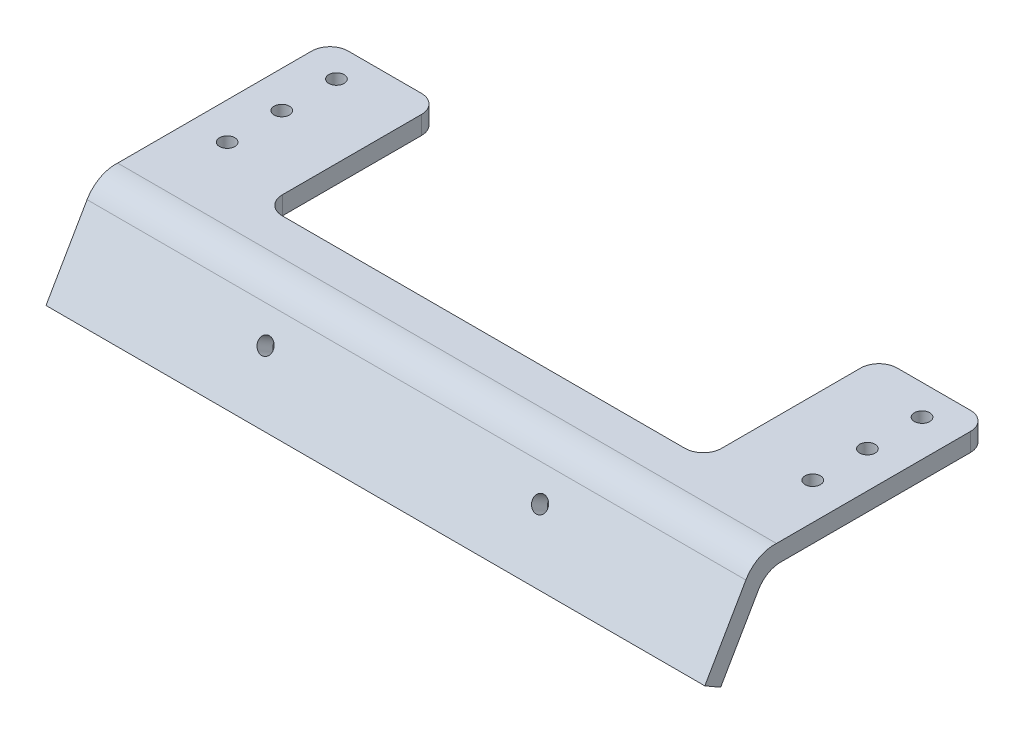
ISO-10303-21;
HEADER;
FILE_DESCRIPTION(('STEP AP214'),'2;1');
FILE_NAME('part.step','',(''),(''),'','','');
FILE_SCHEMA(('AUTOMOTIVE_DESIGN { 1 0 10303 214 1 1 1 1 }'));
ENDSEC;
DATA;
#1=APPLICATION_CONTEXT('core data for automotive mechanical design processes');
#2=APPLICATION_PROTOCOL_DEFINITION('international standard','automotive_design',2000,#1);
#3=PRODUCT_CONTEXT('',#1,'mechanical');
#4=PRODUCT('Part','Part','',(#3));
#5=PRODUCT_RELATED_PRODUCT_CATEGORY('part','',(#4));
#6=PRODUCT_DEFINITION_FORMATION('','',#4);
#7=PRODUCT_DEFINITION_CONTEXT('part definition',#1,'design');
#8=PRODUCT_DEFINITION('design','',#6,#7);
#9=PRODUCT_DEFINITION_SHAPE('','',#8);
#10=(LENGTH_UNIT() NAMED_UNIT(*) SI_UNIT(.MILLI.,.METRE.));
#11=(NAMED_UNIT(*) PLANE_ANGLE_UNIT() SI_UNIT($,.RADIAN.));
#12=(NAMED_UNIT(*) SI_UNIT($,.STERADIAN.) SOLID_ANGLE_UNIT());
#13=UNCERTAINTY_MEASURE_WITH_UNIT(LENGTH_MEASURE(1.E-05),#10,'distance_accuracy_value','');
#14=(GEOMETRIC_REPRESENTATION_CONTEXT(3) GLOBAL_UNCERTAINTY_ASSIGNED_CONTEXT((#13)) GLOBAL_UNIT_ASSIGNED_CONTEXT((#10,
#11,#12)) REPRESENTATION_CONTEXT('',''));
#15=CARTESIAN_POINT('',(0.,0.,0.));
#16=DIRECTION('',(0.,0.,1.));
#17=DIRECTION('',(1.,0.,0.));
#18=AXIS2_PLACEMENT_3D('',#15,#16,#17);
#19=CARTESIAN_POINT('',(-90.,5.,-31.5));
#20=DIRECTION('',(0.,0.,1.));
#21=DIRECTION('',(1.,0.,0.));
#22=AXIS2_PLACEMENT_3D('',#19,#20,#21);
#23=PLANE('',#22);
#24=DIRECTION('',(-1.,0.,0.));
#25=VECTOR('',#24,1.);
#26=CARTESIAN_POINT('',(-90.,0.,-31.5));
#27=LINE('',#26,#25);
#28=CARTESIAN_POINT('',(84.9999999999999,0.,-31.5));
#29=VERTEX_POINT('',#28);
#30=CARTESIAN_POINT('',(65.,0.,-31.5));
#31=VERTEX_POINT('',#30);
#32=EDGE_CURVE('E251',#29,#31,#27,.T.);
#33=ORIENTED_EDGE('',*,*,#32,.T.);
#34=DIRECTION('',(0.,1.,0.));
#35=VECTOR('',#34,1.);
#36=CARTESIAN_POINT('',(65.,5.,-31.5));
#37=LINE('',#36,#35);
#38=CARTESIAN_POINT('',(65.,5.,-31.5));
#39=VERTEX_POINT('',#38);
#40=EDGE_CURVE('E287',#31,#39,#37,.T.);
#41=ORIENTED_EDGE('',*,*,#40,.T.);
#42=DIRECTION('',(-1.,0.,0.));
#43=VECTOR('',#42,1.);
#44=CARTESIAN_POINT('',(-90.,5.,-31.5));
#45=LINE('',#44,#43);
#46=CARTESIAN_POINT('',(84.9999999999999,5.,-31.5));
#47=VERTEX_POINT('',#46);
#48=EDGE_CURVE('E244',#47,#39,#45,.T.);
#49=ORIENTED_EDGE('',*,*,#48,.F.);
#50=DIRECTION('',(0.,-1.,0.));
#51=VECTOR('',#50,1.);
#52=CARTESIAN_POINT('',(85.,5.,-31.5));
#53=LINE('',#52,#51);
#54=EDGE_CURVE('E284',#47,#29,#53,.T.);
#55=ORIENTED_EDGE('',*,*,#54,.T.);
#56=EDGE_LOOP('',(#33,#41,#49,#55));
#57=FACE_BOUND('',#56,.T.);
#58=ADVANCED_FACE('F34',(#57),#23,.F.);
#59=CARTESIAN_POINT('',(90.,5.,-31.5));
#60=DIRECTION('',(-1.,0.,0.));
#61=DIRECTION('',(0.,0.,1.));
#62=AXIS2_PLACEMENT_3D('',#59,#60,#61);
#63=PLANE('',#62);
#64=DIRECTION('',(0.,0.,-1.));
#65=VECTOR('',#64,1.);
#66=CARTESIAN_POINT('',(90.,0.,-31.5));
#67=LINE('',#66,#65);
#68=CARTESIAN_POINT('',(90.,0.,25.3452994616207));
#69=VERTEX_POINT('',#68);
#70=CARTESIAN_POINT('',(90.,0.,-26.5));
#71=VERTEX_POINT('',#70);
#72=EDGE_CURVE('E234',#69,#71,#67,.T.);
#73=ORIENTED_EDGE('',*,*,#72,.T.);
#74=DIRECTION('',(0.,-1.,0.));
#75=VECTOR('',#74,1.);
#76=CARTESIAN_POINT('',(90.,5.,-26.5));
#77=LINE('',#76,#75);
#78=CARTESIAN_POINT('',(90.,5.,-26.5));
#79=VERTEX_POINT('',#78);
#80=EDGE_CURVE('E304',#71,#79,#77,.F.);
#81=ORIENTED_EDGE('',*,*,#80,.T.);
#82=DIRECTION('',(0.,0.,-1.));
#83=VECTOR('',#82,1.);
#84=CARTESIAN_POINT('',(90.,5.,-31.5));
#85=LINE('',#84,#83);
#86=CARTESIAN_POINT('',(90.,5.,26.5));
#87=VERTEX_POINT('',#86);
#88=EDGE_CURVE('E237',#87,#79,#85,.T.);
#89=ORIENTED_EDGE('',*,*,#88,.F.);
#90=CARTESIAN_POINT('',(90.,-3.98212002188447,27.0670272590115));
#91=DIRECTION('',(-1.,0.,0.));
#92=DIRECTION('',(0.,0.,1.));
#93=AXIS2_PLACEMENT_3D('',#90,#91,#92);
#94=CIRCLE('',#93,9.);
#95=CARTESIAN_POINT('',(90.,0.517879978115491,34.8612558930714));
#96=VERTEX_POINT('',#95);
#97=EDGE_CURVE('E256',#87,#96,#94,.F.);
#98=ORIENTED_EDGE('',*,*,#97,.T.);
#99=DIRECTION('',(0.,0.86602540378444,-0.499999999999998));
#100=VECTOR('',#99,1.);
#101=CARTESIAN_POINT('',(90.,-18.9137748154254,46.0801270189221));
#102=LINE('',#101,#100);
#103=CARTESIAN_POINT('',(90.,-18.9137748154254,46.0801270189221));
#104=VERTEX_POINT('',#103);
#105=EDGE_CURVE('E171',#104,#96,#102,.T.);
#106=ORIENTED_EDGE('',*,*,#105,.F.);
#107=DIRECTION('',(0.,-0.499999999999998,-0.86602540378444));
#108=VECTOR('',#107,1.);
#109=CARTESIAN_POINT('',(90.,-18.9137748154254,46.0801270189221));
#110=LINE('',#109,#108);
#111=CARTESIAN_POINT('',(90.,-21.4137748154254,41.7499999999999));
#112=VERTEX_POINT('',#111);
#113=EDGE_CURVE('E182',#104,#112,#110,.T.);
#114=ORIENTED_EDGE('',*,*,#113,.T.);
#115=DIRECTION('',(0.,0.86602540378444,-0.499999999999998));
#116=VECTOR('',#115,1.);
#117=CARTESIAN_POINT('',(90.,-21.4137748154254,41.7499999999999));
#118=LINE('',#117,#116);
#119=CARTESIAN_POINT('',(90.,-3.50000000000002,31.4074772881118));
#120=VERTEX_POINT('',#119);
#121=EDGE_CURVE('E191',#112,#120,#118,.T.);
#122=ORIENTED_EDGE('',*,*,#121,.T.);
#123=CARTESIAN_POINT('',(90.,-7.,25.3452994616207));
#124=DIRECTION('',(-1.,0.,0.));
#125=DIRECTION('',(0.,0.,1.));
#126=AXIS2_PLACEMENT_3D('',#123,#124,#125);
#127=CIRCLE('',#126,7.);
#128=EDGE_CURVE('E265',#120,#69,#127,.T.);
#129=ORIENTED_EDGE('',*,*,#128,.T.);
#130=EDGE_LOOP('',(#73,#81,#89,#98,#106,#114,#122,#129));
#131=FACE_BOUND('',#130,.T.);
#132=ADVANCED_FACE('F395',(#131),#63,.F.);
#133=CARTESIAN_POINT('',(-65.,0.,-31.5));
#134=VERTEX_POINT('',#133);
#135=CARTESIAN_POINT('',(-85.,0.,-31.5));
#136=VERTEX_POINT('',#135);
#137=EDGE_CURVE('E249',#134,#136,#27,.T.);
#138=ORIENTED_EDGE('',*,*,#137,.T.);
#139=DIRECTION('',(0.,-1.,0.));
#140=VECTOR('',#139,1.);
#141=CARTESIAN_POINT('',(-85.,5.,-31.5));
#142=LINE('',#141,#140);
#143=CARTESIAN_POINT('',(-85.,5.,-31.5));
#144=VERTEX_POINT('',#143);
#145=EDGE_CURVE('E311',#136,#144,#142,.F.);
#146=ORIENTED_EDGE('',*,*,#145,.T.);
#147=CARTESIAN_POINT('',(-65.,5.,-31.5));
#148=VERTEX_POINT('',#147);
#149=EDGE_CURVE('E240',#148,#144,#45,.T.);
#150=ORIENTED_EDGE('',*,*,#149,.F.);
#151=DIRECTION('',(0.,-1.,0.));
#152=VECTOR('',#151,1.);
#153=CARTESIAN_POINT('',(-65.,5.,-31.5));
#154=LINE('',#153,#152);
#155=EDGE_CURVE('E309',#148,#134,#154,.T.);
#156=ORIENTED_EDGE('',*,*,#155,.T.);
#157=EDGE_LOOP('',(#138,#146,#150,#156));
#158=FACE_BOUND('',#157,.T.);
#159=ADVANCED_FACE('F374',(#158),#23,.F.);
#160=CARTESIAN_POINT('',(-90.,5.,-31.5));
#161=DIRECTION('',(1.,0.,0.));
#162=DIRECTION('',(0.,0.,-1.));
#163=AXIS2_PLACEMENT_3D('',#160,#161,#162);
#164=PLANE('',#163);
#165=DIRECTION('',(0.,0.,1.));
#166=VECTOR('',#165,1.);
#167=CARTESIAN_POINT('',(-90.,5.,-31.5));
#168=LINE('',#167,#166);
#169=CARTESIAN_POINT('',(-90.,5.,-26.5));
#170=VERTEX_POINT('',#169);
#171=CARTESIAN_POINT('',(-90.,5.,26.5));
#172=VERTEX_POINT('',#171);
#173=EDGE_CURVE('E245',#170,#172,#168,.T.);
#174=ORIENTED_EDGE('',*,*,#173,.F.);
#175=DIRECTION('',(0.,-1.,0.));
#176=VECTOR('',#175,1.);
#177=CARTESIAN_POINT('',(-90.,5.,-26.5));
#178=LINE('',#177,#176);
#179=CARTESIAN_POINT('',(-90.,0.,-26.5));
#180=VERTEX_POINT('',#179);
#181=EDGE_CURVE('E306',#170,#180,#178,.T.);
#182=ORIENTED_EDGE('',*,*,#181,.T.);
#183=DIRECTION('',(0.,0.,1.));
#184=VECTOR('',#183,1.);
#185=CARTESIAN_POINT('',(-90.,0.,-31.5));
#186=LINE('',#185,#184);
#187=CARTESIAN_POINT('',(-90.,0.,25.3452994616207));
#188=VERTEX_POINT('',#187);
#189=EDGE_CURVE('E241',#180,#188,#186,.T.);
#190=ORIENTED_EDGE('',*,*,#189,.T.);
#191=CARTESIAN_POINT('',(-90.,-7.,25.3452994616207));
#192=DIRECTION('',(1.,0.,0.));
#193=DIRECTION('',(0.,0.,-1.));
#194=AXIS2_PLACEMENT_3D('',#191,#192,#193);
#195=CIRCLE('',#194,7.);
#196=CARTESIAN_POINT('',(-90.,-3.50000000000002,31.4074772881118));
#197=VERTEX_POINT('',#196);
#198=EDGE_CURVE('E263',#188,#197,#195,.T.);
#199=ORIENTED_EDGE('',*,*,#198,.T.);
#200=DIRECTION('',(0.,-0.86602540378444,0.499999999999998));
#201=VECTOR('',#200,1.);
#202=CARTESIAN_POINT('',(-90.,-21.4137748154254,41.7499999999999));
#203=LINE('',#202,#201);
#204=CARTESIAN_POINT('',(-90.,-21.4137748154254,41.7499999999999));
#205=VERTEX_POINT('',#204);
#206=EDGE_CURVE('E178',#197,#205,#203,.T.);
#207=ORIENTED_EDGE('',*,*,#206,.T.);
#208=DIRECTION('',(0.,-0.499999999999998,-0.86602540378444));
#209=VECTOR('',#208,1.);
#210=CARTESIAN_POINT('',(-90.,-18.9137748154254,46.0801270189221));
#211=LINE('',#210,#209);
#212=CARTESIAN_POINT('',(-90.,-18.9137748154254,46.0801270189221));
#213=VERTEX_POINT('',#212);
#214=EDGE_CURVE('E174',#213,#205,#211,.T.);
#215=ORIENTED_EDGE('',*,*,#214,.F.);
#216=DIRECTION('',(0.,-0.86602540378444,0.499999999999998));
#217=VECTOR('',#216,1.);
#218=CARTESIAN_POINT('',(-90.,-18.9137748154254,46.0801270189221));
#219=LINE('',#218,#217);
#220=CARTESIAN_POINT('',(-90.,0.517879978115507,34.8612558930715));
#221=VERTEX_POINT('',#220);
#222=EDGE_CURVE('E160',#221,#213,#219,.T.);
#223=ORIENTED_EDGE('',*,*,#222,.F.);
#224=CARTESIAN_POINT('',(-90.,-3.98212002188447,27.0670272590115));
#225=DIRECTION('',(1.,0.,0.));
#226=DIRECTION('',(0.,0.,-1.));
#227=AXIS2_PLACEMENT_3D('',#224,#225,#226);
#228=CIRCLE('',#227,9.);
#229=EDGE_CURVE('E254',#221,#172,#228,.F.);
#230=ORIENTED_EDGE('',*,*,#229,.T.);
#231=EDGE_LOOP('',(#174,#182,#190,#199,#207,#215,#223,#230));
#232=FACE_BOUND('',#231,.T.);
#233=ADVANCED_FACE('F176',(#232),#164,.F.);
#234=CARTESIAN_POINT('',(0.,5.,0.));
#235=DIRECTION('',(0.,1.,0.));
#236=DIRECTION('',(0.,0.,1.));
#237=AXIS2_PLACEMENT_3D('',#234,#235,#236);
#238=PLANE('',#237);
#239=ORIENTED_EDGE('',*,*,#48,.T.);
#240=CARTESIAN_POINT('',(65.,5.,-26.5));
#241=DIRECTION('',(0.,1.,0.));
#242=DIRECTION('',(0.,0.,1.));
#243=AXIS2_PLACEMENT_3D('',#240,#241,#242);
#244=CIRCLE('',#243,5.);
#245=CARTESIAN_POINT('',(60.,5.,-26.5));
#246=VERTEX_POINT('',#245);
#247=EDGE_CURVE('E296',#39,#246,#244,.T.);
#248=ORIENTED_EDGE('',*,*,#247,.T.);
#249=DIRECTION('',(0.,0.,-1.));
#250=VECTOR('',#249,1.);
#251=CARTESIAN_POINT('',(60.,5.,-33.5));
#252=LINE('',#251,#250);
#253=CARTESIAN_POINT('',(60.,5.,11.5));
#254=VERTEX_POINT('',#253);
#255=EDGE_CURVE('E325',#254,#246,#252,.T.);
#256=ORIENTED_EDGE('',*,*,#255,.F.);
#257=CARTESIAN_POINT('',(55.,5.,11.5));
#258=DIRECTION('',(0.,1.,0.));
#259=DIRECTION('',(0.,0.,1.));
#260=AXIS2_PLACEMENT_3D('',#257,#258,#259);
#261=CIRCLE('',#260,5.);
#262=CARTESIAN_POINT('',(55.,5.,16.5));
#263=VERTEX_POINT('',#262);
#264=EDGE_CURVE('E42',#254,#263,#261,.F.);
#265=ORIENTED_EDGE('',*,*,#264,.T.);
#266=DIRECTION('',(1.,0.,0.));
#267=VECTOR('',#266,1.);
#268=CARTESIAN_POINT('',(-60.,5.,16.5));
#269=LINE('',#268,#267);
#270=CARTESIAN_POINT('',(-55.,5.,16.5));
#271=VERTEX_POINT('',#270);
#272=EDGE_CURVE('E323',#271,#263,#269,.T.);
#273=ORIENTED_EDGE('',*,*,#272,.F.);
#274=CARTESIAN_POINT('',(-55.,5.,11.5));
#275=DIRECTION('',(0.,1.,0.));
#276=DIRECTION('',(0.,0.,1.));
#277=AXIS2_PLACEMENT_3D('',#274,#275,#276);
#278=CIRCLE('',#277,5.);
#279=CARTESIAN_POINT('',(-60.,5.,11.5));
#280=VERTEX_POINT('',#279);
#281=EDGE_CURVE('E313',#271,#280,#278,.F.);
#282=ORIENTED_EDGE('',*,*,#281,.T.);
#283=DIRECTION('',(0.,0.,1.));
#284=VECTOR('',#283,1.);
#285=CARTESIAN_POINT('',(-60.,5.,-33.5));
#286=LINE('',#285,#284);
#287=CARTESIAN_POINT('',(-60.,5.,-26.5));
#288=VERTEX_POINT('',#287);
#289=EDGE_CURVE('E335',#288,#280,#286,.T.);
#290=ORIENTED_EDGE('',*,*,#289,.F.);
#291=CARTESIAN_POINT('',(-65.,5.,-26.5));
#292=DIRECTION('',(0.,1.,0.));
#293=DIRECTION('',(0.,0.,1.));
#294=AXIS2_PLACEMENT_3D('',#291,#292,#293);
#295=CIRCLE('',#294,5.);
#296=EDGE_CURVE('E290',#288,#148,#295,.T.);
#297=ORIENTED_EDGE('',*,*,#296,.T.);
#298=ORIENTED_EDGE('',*,*,#149,.T.);
#299=CARTESIAN_POINT('',(-85.,5.,-26.5));
#300=DIRECTION('',(0.,1.,0.));
#301=DIRECTION('',(0.,0.,1.));
#302=AXIS2_PLACEMENT_3D('',#299,#300,#301);
#303=CIRCLE('',#302,5.);
#304=EDGE_CURVE('E292',#144,#170,#303,.T.);
#305=ORIENTED_EDGE('',*,*,#304,.T.);
#306=ORIENTED_EDGE('',*,*,#173,.T.);
#307=DIRECTION('',(-1.,0.,0.));
#308=VECTOR('',#307,1.);
#309=CARTESIAN_POINT('',(110.,5.,26.5));
#310=LINE('',#309,#308);
#311=EDGE_CURVE('E181',#87,#172,#310,.T.);
#312=ORIENTED_EDGE('',*,*,#311,.F.);
#313=ORIENTED_EDGE('',*,*,#88,.T.);
#314=CARTESIAN_POINT('',(85.,5.,-26.5));
#315=DIRECTION('',(0.,1.,0.));
#316=DIRECTION('',(0.,0.,1.));
#317=AXIS2_PLACEMENT_3D('',#314,#315,#316);
#318=CIRCLE('',#317,5.);
#319=EDGE_CURVE('E294',#79,#47,#318,.T.);
#320=ORIENTED_EDGE('',*,*,#319,.T.);
#321=EDGE_LOOP('',(#239,#248,#256,#265,#273,#282,#290,#297,#298,#305,#306,#312,#313,#320));
#322=FACE_BOUND('',#321,.T.);
#323=CARTESIAN_POINT('',(80.0000000000002,5.,-8.34));
#324=DIRECTION('',(0.,1.,0.));
#325=DIRECTION('',(0.,0.,1.));
#326=AXIS2_PLACEMENT_3D('',#323,#324,#325);
#327=CIRCLE('',#326,2.1);
#328=CARTESIAN_POINT('',(80.0000000000002,5.,-6.24));
#329=VERTEX_POINT('',#328);
#330=EDGE_CURVE('E211',#329,#329,#327,.T.);
#331=ORIENTED_EDGE('',*,*,#330,.F.);
#332=EDGE_LOOP('',(#331));
#333=FACE_BOUND('',#332,.T.);
#334=CARTESIAN_POINT('',(80.0000000000002,5.,6.59));
#335=DIRECTION('',(0.,1.,0.));
#336=DIRECTION('',(0.,0.,1.));
#337=AXIS2_PLACEMENT_3D('',#334,#335,#336);
#338=CIRCLE('',#337,2.1);
#339=CARTESIAN_POINT('',(80.0000000000002,5.,8.69));
#340=VERTEX_POINT('',#339);
#341=EDGE_CURVE('E217',#340,#340,#338,.T.);
#342=ORIENTED_EDGE('',*,*,#341,.F.);
#343=EDGE_LOOP('',(#342));
#344=FACE_BOUND('',#343,.T.);
#345=CARTESIAN_POINT('',(-79.9999999999992,5.,-23.27));
#346=DIRECTION('',(0.,1.,0.));
#347=DIRECTION('',(0.,0.,-1.));
#348=AXIS2_PLACEMENT_3D('',#345,#346,#347);
#349=CIRCLE('',#348,2.1);
#350=CARTESIAN_POINT('',(-79.9999999999992,5.,-25.37));
#351=VERTEX_POINT('',#350);
#352=EDGE_CURVE('E223',#351,#351,#349,.T.);
#353=ORIENTED_EDGE('',*,*,#352,.F.);
#354=EDGE_LOOP('',(#353));
#355=FACE_BOUND('',#354,.T.);
#356=CARTESIAN_POINT('',(-79.9999999999992,5.,-8.34));
#357=DIRECTION('',(0.,1.,0.));
#358=DIRECTION('',(0.,0.,-1.));
#359=AXIS2_PLACEMENT_3D('',#356,#357,#358);
#360=CIRCLE('',#359,2.1);
#361=CARTESIAN_POINT('',(-79.9999999999992,5.,-10.44));
#362=VERTEX_POINT('',#361);
#363=EDGE_CURVE('E204',#362,#362,#360,.T.);
#364=ORIENTED_EDGE('',*,*,#363,.F.);
#365=EDGE_LOOP('',(#364));
#366=FACE_BOUND('',#365,.T.);
#367=CARTESIAN_POINT('',(-79.9999999999992,5.,6.59));
#368=DIRECTION('',(0.,1.,0.));
#369=DIRECTION('',(0.,0.,-1.));
#370=AXIS2_PLACEMENT_3D('',#367,#368,#369);
#371=CIRCLE('',#370,2.1);
#372=CARTESIAN_POINT('',(-79.9999999999992,5.,4.48999999999999));
#373=VERTEX_POINT('',#372);
#374=EDGE_CURVE('E200',#373,#373,#371,.T.);
#375=ORIENTED_EDGE('',*,*,#374,.F.);
#376=EDGE_LOOP('',(#375));
#377=FACE_BOUND('',#376,.T.);
#378=CARTESIAN_POINT('',(80.0000000000002,5.,-23.27));
#379=DIRECTION('',(0.,1.,0.));
#380=DIRECTION('',(0.,0.,1.));
#381=AXIS2_PLACEMENT_3D('',#378,#379,#380);
#382=CIRCLE('',#381,2.1);
#383=CARTESIAN_POINT('',(80.0000000000002,5.,-21.17));
#384=VERTEX_POINT('',#383);
#385=EDGE_CURVE('E210',#384,#384,#382,.T.);
#386=ORIENTED_EDGE('',*,*,#385,.F.);
#387=EDGE_LOOP('',(#386));
#388=FACE_BOUND('',#387,.T.);
#389=ADVANCED_FACE('F321',(#322,#333,#344,#355,#366,#377,#388),#238,.T.);
#390=CARTESIAN_POINT('',(0.,0.,0.));
#391=DIRECTION('',(0.,1.,0.));
#392=DIRECTION('',(0.,0.,1.));
#393=AXIS2_PLACEMENT_3D('',#390,#391,#392);
#394=PLANE('',#393);
#395=CARTESIAN_POINT('',(80.0000000000002,0.,-8.34));
#396=DIRECTION('',(0.,1.,0.));
#397=DIRECTION('',(0.,0.,1.));
#398=AXIS2_PLACEMENT_3D('',#395,#396,#397);
#399=CIRCLE('',#398,2.1);
#400=CARTESIAN_POINT('',(80.0000000000002,0.,-6.24));
#401=VERTEX_POINT('',#400);
#402=EDGE_CURVE('E207',#401,#401,#399,.T.);
#403=ORIENTED_EDGE('',*,*,#402,.T.);
#404=EDGE_LOOP('',(#403));
#405=FACE_BOUND('',#404,.T.);
#406=CARTESIAN_POINT('',(80.0000000000002,0.,6.59));
#407=DIRECTION('',(0.,1.,0.));
#408=DIRECTION('',(0.,0.,1.));
#409=AXIS2_PLACEMENT_3D('',#406,#407,#408);
#410=CIRCLE('',#409,2.1);
#411=CARTESIAN_POINT('',(80.0000000000002,0.,8.69));
#412=VERTEX_POINT('',#411);
#413=EDGE_CURVE('E214',#412,#412,#410,.T.);
#414=ORIENTED_EDGE('',*,*,#413,.T.);
#415=EDGE_LOOP('',(#414));
#416=FACE_BOUND('',#415,.T.);
#417=CARTESIAN_POINT('',(-79.9999999999992,0.,-23.27));
#418=DIRECTION('',(0.,1.,0.));
#419=DIRECTION('',(0.,0.,-1.));
#420=AXIS2_PLACEMENT_3D('',#417,#418,#419);
#421=CIRCLE('',#420,2.1);
#422=CARTESIAN_POINT('',(-79.9999999999992,0.,-25.37));
#423=VERTEX_POINT('',#422);
#424=EDGE_CURVE('E220',#423,#423,#421,.T.);
#425=ORIENTED_EDGE('',*,*,#424,.T.);
#426=EDGE_LOOP('',(#425));
#427=FACE_BOUND('',#426,.T.);
#428=CARTESIAN_POINT('',(-79.9999999999992,0.,-8.34));
#429=DIRECTION('',(0.,1.,0.));
#430=DIRECTION('',(0.,0.,-1.));
#431=AXIS2_PLACEMENT_3D('',#428,#429,#430);
#432=CIRCLE('',#431,2.1);
#433=CARTESIAN_POINT('',(-79.9999999999992,0.,-10.44));
#434=VERTEX_POINT('',#433);
#435=EDGE_CURVE('E226',#434,#434,#432,.T.);
#436=ORIENTED_EDGE('',*,*,#435,.T.);
#437=EDGE_LOOP('',(#436));
#438=FACE_BOUND('',#437,.T.);
#439=CARTESIAN_POINT('',(-79.9999999999992,0.,6.59));
#440=DIRECTION('',(0.,1.,0.));
#441=DIRECTION('',(0.,0.,-1.));
#442=AXIS2_PLACEMENT_3D('',#439,#440,#441);
#443=CIRCLE('',#442,2.1);
#444=CARTESIAN_POINT('',(-79.9999999999992,0.,4.48999999999999));
#445=VERTEX_POINT('',#444);
#446=EDGE_CURVE('E201',#445,#445,#443,.T.);
#447=ORIENTED_EDGE('',*,*,#446,.T.);
#448=EDGE_LOOP('',(#447));
#449=FACE_BOUND('',#448,.T.);
#450=CARTESIAN_POINT('',(80.0000000000002,0.,-23.27));
#451=DIRECTION('',(0.,1.,0.));
#452=DIRECTION('',(0.,0.,1.));
#453=AXIS2_PLACEMENT_3D('',#450,#451,#452);
#454=CIRCLE('',#453,2.1);
#455=CARTESIAN_POINT('',(80.0000000000002,0.,-21.17));
#456=VERTEX_POINT('',#455);
#457=EDGE_CURVE('E231',#456,#456,#454,.T.);
#458=ORIENTED_EDGE('',*,*,#457,.T.);
#459=EDGE_LOOP('',(#458));
#460=FACE_BOUND('',#459,.T.);
#461=DIRECTION('',(0.,0.,-1.));
#462=VECTOR('',#461,1.);
#463=CARTESIAN_POINT('',(60.,0.,-33.5));
#464=LINE('',#463,#462);
#465=CARTESIAN_POINT('',(60.,0.,11.5));
#466=VERTEX_POINT('',#465);
#467=CARTESIAN_POINT('',(60.,0.,-26.5));
#468=VERTEX_POINT('',#467);
#469=EDGE_CURVE('E334',#466,#468,#464,.T.);
#470=ORIENTED_EDGE('',*,*,#469,.T.);
#471=CARTESIAN_POINT('',(65.,0.,-26.5));
#472=DIRECTION('',(0.,1.,0.));
#473=DIRECTION('',(0.,0.,1.));
#474=AXIS2_PLACEMENT_3D('',#471,#472,#473);
#475=CIRCLE('',#474,5.);
#476=EDGE_CURVE('E302',#468,#31,#475,.F.);
#477=ORIENTED_EDGE('',*,*,#476,.T.);
#478=ORIENTED_EDGE('',*,*,#32,.F.);
#479=CARTESIAN_POINT('',(85.,0.,-26.5));
#480=DIRECTION('',(0.,1.,0.));
#481=DIRECTION('',(0.,0.,1.));
#482=AXIS2_PLACEMENT_3D('',#479,#480,#481);
#483=CIRCLE('',#482,5.);
#484=EDGE_CURVE('E300',#29,#71,#483,.F.);
#485=ORIENTED_EDGE('',*,*,#484,.T.);
#486=ORIENTED_EDGE('',*,*,#72,.F.);
#487=DIRECTION('',(-1.,0.,0.));
#488=VECTOR('',#487,1.);
#489=CARTESIAN_POINT('',(0.,0.,25.3452994616207));
#490=LINE('',#489,#488);
#491=EDGE_CURVE('E258',#69,#188,#490,.T.);
#492=ORIENTED_EDGE('',*,*,#491,.T.);
#493=ORIENTED_EDGE('',*,*,#189,.F.);
#494=CARTESIAN_POINT('',(-85.,0.,-26.5));
#495=DIRECTION('',(0.,1.,0.));
#496=DIRECTION('',(0.,0.,1.));
#497=AXIS2_PLACEMENT_3D('',#494,#495,#496);
#498=CIRCLE('',#497,5.);
#499=EDGE_CURVE('E49',#180,#136,#498,.F.);
#500=ORIENTED_EDGE('',*,*,#499,.T.);
#501=ORIENTED_EDGE('',*,*,#137,.F.);
#502=CARTESIAN_POINT('',(-65.,0.,-26.5));
#503=DIRECTION('',(0.,1.,0.));
#504=DIRECTION('',(0.,0.,1.));
#505=AXIS2_PLACEMENT_3D('',#502,#503,#504);
#506=CIRCLE('',#505,5.);
#507=CARTESIAN_POINT('',(-60.,0.,-26.5));
#508=VERTEX_POINT('',#507);
#509=EDGE_CURVE('E57',#134,#508,#506,.F.);
#510=ORIENTED_EDGE('',*,*,#509,.T.);
#511=DIRECTION('',(0.,0.,1.));
#512=VECTOR('',#511,1.);
#513=CARTESIAN_POINT('',(-60.,0.,0.));
#514=LINE('',#513,#512);
#515=CARTESIAN_POINT('',(-60.,0.,11.5));
#516=VERTEX_POINT('',#515);
#517=EDGE_CURVE('E267',#508,#516,#514,.T.);
#518=ORIENTED_EDGE('',*,*,#517,.T.);
#519=CARTESIAN_POINT('',(-55.,0.,11.5));
#520=DIRECTION('',(0.,1.,0.));
#521=DIRECTION('',(0.,0.,1.));
#522=AXIS2_PLACEMENT_3D('',#519,#520,#521);
#523=CIRCLE('',#522,5.);
#524=CARTESIAN_POINT('',(-55.,0.,16.5));
#525=VERTEX_POINT('',#524);
#526=EDGE_CURVE('E315',#516,#525,#523,.T.);
#527=ORIENTED_EDGE('',*,*,#526,.T.);
#528=DIRECTION('',(1.,0.,0.));
#529=VECTOR('',#528,1.);
#530=CARTESIAN_POINT('',(-60.,0.,16.5));
#531=LINE('',#530,#529);
#532=CARTESIAN_POINT('',(55.,0.,16.5));
#533=VERTEX_POINT('',#532);
#534=EDGE_CURVE('E343',#525,#533,#531,.T.);
#535=ORIENTED_EDGE('',*,*,#534,.T.);
#536=CARTESIAN_POINT('',(55.,0.,11.5));
#537=DIRECTION('',(0.,1.,0.));
#538=DIRECTION('',(0.,0.,1.));
#539=AXIS2_PLACEMENT_3D('',#536,#537,#538);
#540=CIRCLE('',#539,5.);
#541=EDGE_CURVE('E11',#533,#466,#540,.T.);
#542=ORIENTED_EDGE('',*,*,#541,.T.);
#543=EDGE_LOOP('',(#470,#477,#478,#485,#486,#492,#493,#500,#501,#510,#518,#527,#535,#542));
#544=FACE_BOUND('',#543,.T.);
#545=ADVANCED_FACE('F341',(#405,#416,#427,#438,#449,#460,#544),#394,.F.);
#546=CARTESIAN_POINT('',(80.0000000000002,0.,-23.27));
#547=DIRECTION('',(0.,1.,0.));
#548=DIRECTION('',(0.,0.,1.));
#549=AXIS2_PLACEMENT_3D('',#546,#547,#548);
#550=CYLINDRICAL_SURFACE('',#549,2.1);
#551=ORIENTED_EDGE('',*,*,#457,.F.);
#552=EDGE_LOOP('',(#551));
#553=FACE_BOUND('',#552,.T.);
#554=ORIENTED_EDGE('',*,*,#385,.T.);
#555=EDGE_LOOP('',(#554));
#556=FACE_BOUND('',#555,.T.);
#557=ADVANCED_FACE('F414',(#553,#556),#550,.F.);
#558=CARTESIAN_POINT('',(-79.9999999999992,0.,6.59));
#559=DIRECTION('',(0.,1.,0.));
#560=DIRECTION('',(0.,0.,1.));
#561=AXIS2_PLACEMENT_3D('',#558,#559,#560);
#562=CYLINDRICAL_SURFACE('',#561,2.1);
#563=ORIENTED_EDGE('',*,*,#446,.F.);
#564=EDGE_LOOP('',(#563));
#565=FACE_BOUND('',#564,.T.);
#566=ORIENTED_EDGE('',*,*,#374,.T.);
#567=EDGE_LOOP('',(#566));
#568=FACE_BOUND('',#567,.T.);
#569=ADVANCED_FACE('F419',(#565,#568),#562,.F.);
#570=CARTESIAN_POINT('',(-79.9999999999992,0.,-8.34));
#571=DIRECTION('',(0.,1.,0.));
#572=DIRECTION('',(0.,0.,1.));
#573=AXIS2_PLACEMENT_3D('',#570,#571,#572);
#574=CYLINDRICAL_SURFACE('',#573,2.1);
#575=ORIENTED_EDGE('',*,*,#435,.F.);
#576=EDGE_LOOP('',(#575));
#577=FACE_BOUND('',#576,.T.);
#578=ORIENTED_EDGE('',*,*,#363,.T.);
#579=EDGE_LOOP('',(#578));
#580=FACE_BOUND('',#579,.T.);
#581=ADVANCED_FACE('F421',(#577,#580),#574,.F.);
#582=CARTESIAN_POINT('',(-79.9999999999992,0.,-23.27));
#583=DIRECTION('',(0.,1.,0.));
#584=DIRECTION('',(0.,0.,1.));
#585=AXIS2_PLACEMENT_3D('',#582,#583,#584);
#586=CYLINDRICAL_SURFACE('',#585,2.1);
#587=ORIENTED_EDGE('',*,*,#424,.F.);
#588=EDGE_LOOP('',(#587));
#589=FACE_BOUND('',#588,.T.);
#590=ORIENTED_EDGE('',*,*,#352,.T.);
#591=EDGE_LOOP('',(#590));
#592=FACE_BOUND('',#591,.T.);
#593=ADVANCED_FACE('F424',(#589,#592),#586,.F.);
#594=CARTESIAN_POINT('',(80.0000000000002,0.,6.59));
#595=DIRECTION('',(0.,1.,0.));
#596=DIRECTION('',(0.,0.,1.));
#597=AXIS2_PLACEMENT_3D('',#594,#595,#596);
#598=CYLINDRICAL_SURFACE('',#597,2.1);
#599=ORIENTED_EDGE('',*,*,#413,.F.);
#600=EDGE_LOOP('',(#599));
#601=FACE_BOUND('',#600,.T.);
#602=ORIENTED_EDGE('',*,*,#341,.T.);
#603=EDGE_LOOP('',(#602));
#604=FACE_BOUND('',#603,.T.);
#605=ADVANCED_FACE('F428',(#601,#604),#598,.F.);
#606=CARTESIAN_POINT('',(80.0000000000002,0.,-8.34));
#607=DIRECTION('',(0.,1.,0.));
#608=DIRECTION('',(0.,0.,1.));
#609=AXIS2_PLACEMENT_3D('',#606,#607,#608);
#610=CYLINDRICAL_SURFACE('',#609,2.1);
#611=ORIENTED_EDGE('',*,*,#402,.F.);
#612=EDGE_LOOP('',(#611));
#613=FACE_BOUND('',#612,.T.);
#614=ORIENTED_EDGE('',*,*,#330,.T.);
#615=EDGE_LOOP('',(#614));
#616=FACE_BOUND('',#615,.T.);
#617=ADVANCED_FACE('F432',(#613,#616),#610,.F.);
#618=CARTESIAN_POINT('',(0.,12.7248366001438,22.0400635094611));
#619=DIRECTION('',(0.,-0.499999999999998,-0.86602540378444));
#620=DIRECTION('',(0.,0.86602540378444,-0.499999999999998));
#621=AXIS2_PLACEMENT_3D('',#618,#619,#620);
#622=PLANE('',#621);
#623=CARTESIAN_POINT('',(37.5,-8.4233937586588,34.25));
#624=DIRECTION('',(0.,0.499999999999998,0.86602540378444));
#625=DIRECTION('',(0.,-0.86602540378444,0.499999999999998));
#626=AXIS2_PLACEMENT_3D('',#623,#624,#625);
#627=CIRCLE('',#626,2.1);
#628=CARTESIAN_POINT('',(37.5,-10.2420471066061,35.2999999999999));
#629=VERTEX_POINT('',#628);
#630=EDGE_CURVE('E194',#629,#629,#627,.T.);
#631=ORIENTED_EDGE('',*,*,#630,.T.);
#632=EDGE_LOOP('',(#631));
#633=FACE_BOUND('',#632,.T.);
#634=CARTESIAN_POINT('',(-37.5,-8.4233937586588,34.25));
#635=DIRECTION('',(0.,0.499999999999998,0.86602540378444));
#636=DIRECTION('',(0.,0.86602540378444,-0.499999999999998));
#637=AXIS2_PLACEMENT_3D('',#634,#635,#636);
#638=CIRCLE('',#637,2.1);
#639=CARTESIAN_POINT('',(-37.5,-6.60474041071147,33.2));
#640=VERTEX_POINT('',#639);
#641=EDGE_CURVE('E359',#640,#640,#638,.T.);
#642=ORIENTED_EDGE('',*,*,#641,.T.);
#643=EDGE_LOOP('',(#642));
#644=FACE_BOUND('',#643,.T.);
#645=ORIENTED_EDGE('',*,*,#206,.F.);
#646=DIRECTION('',(-1.,0.,0.));
#647=VECTOR('',#646,1.);
#648=CARTESIAN_POINT('',(0.,-3.50000000000002,31.4074772881118));
#649=LINE('',#648,#647);
#650=EDGE_CURVE('E261',#197,#120,#649,.F.);
#651=ORIENTED_EDGE('',*,*,#650,.T.);
#652=ORIENTED_EDGE('',*,*,#121,.F.);
#653=DIRECTION('',(1.,0.,0.));
#654=VECTOR('',#653,1.);
#655=CARTESIAN_POINT('',(-90.,-21.4137748154254,41.7499999999999));
#656=LINE('',#655,#654);
#657=EDGE_CURVE('E196',#205,#112,#656,.T.);
#658=ORIENTED_EDGE('',*,*,#657,.F.);
#659=EDGE_LOOP('',(#645,#651,#652,#658));
#660=FACE_BOUND('',#659,.T.);
#661=ADVANCED_FACE('F436',(#633,#644,#660),#622,.T.);
#662=CARTESIAN_POINT('',(-90.,-18.9137748154254,46.0801270189221));
#663=DIRECTION('',(0.,0.86602540378444,-0.499999999999998));
#664=DIRECTION('',(0.,0.499999999999998,0.86602540378444));
#665=AXIS2_PLACEMENT_3D('',#662,#663,#664);
#666=PLANE('',#665);
#667=ORIENTED_EDGE('',*,*,#657,.T.);
#668=ORIENTED_EDGE('',*,*,#113,.F.);
#669=DIRECTION('',(1.,0.,0.));
#670=VECTOR('',#669,1.);
#671=CARTESIAN_POINT('',(-90.,-18.9137748154254,46.0801270189221));
#672=LINE('',#671,#670);
#673=EDGE_CURVE('E165',#213,#104,#672,.T.);
#674=ORIENTED_EDGE('',*,*,#673,.F.);
#675=ORIENTED_EDGE('',*,*,#214,.T.);
#676=EDGE_LOOP('',(#667,#668,#674,#675));
#677=FACE_BOUND('',#676,.T.);
#678=ADVANCED_FACE('F184',(#677),#666,.F.);
#679=CARTESIAN_POINT('',(0.,15.2248366001438,26.3701905283833));
#680=DIRECTION('',(0.,-0.499999999999998,-0.86602540378444));
#681=DIRECTION('',(0.,0.86602540378444,-0.499999999999998));
#682=AXIS2_PLACEMENT_3D('',#679,#680,#681);
#683=PLANE('',#682);
#684=CARTESIAN_POINT('',(37.5,-5.92339375865881,38.5801270189222));
#685=DIRECTION('',(0.,0.499999999999998,0.86602540378444));
#686=DIRECTION('',(0.,-0.86602540378444,0.499999999999998));
#687=AXIS2_PLACEMENT_3D('',#684,#685,#686);
#688=CIRCLE('',#687,2.1);
#689=CARTESIAN_POINT('',(37.5,-7.74204710660613,39.6301270189222));
#690=VERTEX_POINT('',#689);
#691=EDGE_CURVE('E356',#690,#690,#688,.T.);
#692=ORIENTED_EDGE('',*,*,#691,.F.);
#693=EDGE_LOOP('',(#692));
#694=FACE_BOUND('',#693,.T.);
#695=CARTESIAN_POINT('',(-37.5,-5.92339375865881,38.5801270189222));
#696=DIRECTION('',(0.,0.499999999999998,0.86602540378444));
#697=DIRECTION('',(0.,0.86602540378444,-0.499999999999998));
#698=AXIS2_PLACEMENT_3D('',#695,#696,#697);
#699=CIRCLE('',#698,2.1);
#700=CARTESIAN_POINT('',(-37.5,-4.10474041071148,37.5301270189222));
#701=VERTEX_POINT('',#700);
#702=EDGE_CURVE('E348',#701,#701,#699,.T.);
#703=ORIENTED_EDGE('',*,*,#702,.F.);
#704=EDGE_LOOP('',(#703));
#705=FACE_BOUND('',#704,.T.);
#706=ORIENTED_EDGE('',*,*,#105,.T.);
#707=DIRECTION('',(-1.,0.,0.));
#708=VECTOR('',#707,1.);
#709=CARTESIAN_POINT('',(0.,0.517879978115502,34.8612558930715));
#710=LINE('',#709,#708);
#711=EDGE_CURVE('E168',#96,#221,#710,.T.);
#712=ORIENTED_EDGE('',*,*,#711,.T.);
#713=ORIENTED_EDGE('',*,*,#222,.T.);
#714=ORIENTED_EDGE('',*,*,#673,.T.);
#715=EDGE_LOOP('',(#706,#712,#713,#714));
#716=FACE_BOUND('',#715,.T.);
#717=ADVANCED_FACE('F163',(#694,#705,#716),#683,.F.);
#718=CARTESIAN_POINT('',(-37.5,-8.4233937586588,34.25));
#719=DIRECTION('',(0.,0.499999999999998,0.86602540378444));
#720=DIRECTION('',(0.,-0.86602540378444,0.499999999999998));
#721=AXIS2_PLACEMENT_3D('',#718,#719,#720);
#722=CYLINDRICAL_SURFACE('',#721,2.1);
#723=ORIENTED_EDGE('',*,*,#641,.F.);
#724=EDGE_LOOP('',(#723));
#725=FACE_BOUND('',#724,.T.);
#726=ORIENTED_EDGE('',*,*,#702,.T.);
#727=EDGE_LOOP('',(#726));
#728=FACE_BOUND('',#727,.T.);
#729=ADVANCED_FACE('F448',(#725,#728),#722,.F.);
#730=CARTESIAN_POINT('',(37.5,-8.4233937586588,34.25));
#731=DIRECTION('',(0.,0.499999999999998,0.86602540378444));
#732=DIRECTION('',(0.,-0.86602540378444,0.499999999999998));
#733=AXIS2_PLACEMENT_3D('',#730,#731,#732);
#734=CYLINDRICAL_SURFACE('',#733,2.1);
#735=ORIENTED_EDGE('',*,*,#630,.F.);
#736=EDGE_LOOP('',(#735));
#737=FACE_BOUND('',#736,.T.);
#738=ORIENTED_EDGE('',*,*,#691,.T.);
#739=EDGE_LOOP('',(#738));
#740=FACE_BOUND('',#739,.T.);
#741=ADVANCED_FACE('F452',(#737,#740),#734,.F.);
#742=CARTESIAN_POINT('',(-90.,-3.98212002188447,27.0670272590115));
#743=DIRECTION('',(-1.,0.,0.));
#744=DIRECTION('',(0.,0.,1.));
#745=AXIS2_PLACEMENT_3D('',#742,#743,#744);
#746=CYLINDRICAL_SURFACE('',#745,9.);
#747=ORIENTED_EDGE('',*,*,#97,.F.);
#748=ORIENTED_EDGE('',*,*,#311,.T.);
#749=ORIENTED_EDGE('',*,*,#229,.F.);
#750=ORIENTED_EDGE('',*,*,#711,.F.);
#751=EDGE_LOOP('',(#747,#748,#749,#750));
#752=FACE_BOUND('',#751,.T.);
#753=ADVANCED_FACE('F366',(#752),#746,.T.);
#754=CARTESIAN_POINT('',(0.,-7.,25.3452994616207));
#755=DIRECTION('',(-1.,0.,0.));
#756=DIRECTION('',(0.,0.,1.));
#757=AXIS2_PLACEMENT_3D('',#754,#755,#756);
#758=CYLINDRICAL_SURFACE('',#757,7.);
#759=ORIENTED_EDGE('',*,*,#128,.F.);
#760=ORIENTED_EDGE('',*,*,#650,.F.);
#761=ORIENTED_EDGE('',*,*,#198,.F.);
#762=ORIENTED_EDGE('',*,*,#491,.F.);
#763=EDGE_LOOP('',(#759,#760,#761,#762));
#764=FACE_BOUND('',#763,.T.);
#765=ADVANCED_FACE('F459',(#764),#758,.F.);
#766=CARTESIAN_POINT('',(60.,0.,-33.5));
#767=DIRECTION('',(1.,0.,0.));
#768=DIRECTION('',(0.,0.,-1.));
#769=AXIS2_PLACEMENT_3D('',#766,#767,#768);
#770=PLANE('',#769);
#771=ORIENTED_EDGE('',*,*,#469,.F.);
#772=DIRECTION('',(0.,1.,0.));
#773=VECTOR('',#772,1.);
#774=CARTESIAN_POINT('',(60.,5.,11.5));
#775=LINE('',#774,#773);
#776=EDGE_CURVE('E281',#466,#254,#775,.T.);
#777=ORIENTED_EDGE('',*,*,#776,.T.);
#778=ORIENTED_EDGE('',*,*,#255,.T.);
#779=DIRECTION('',(0.,1.,0.));
#780=VECTOR('',#779,1.);
#781=CARTESIAN_POINT('',(60.,0.,-26.5));
#782=LINE('',#781,#780);
#783=EDGE_CURVE('E279',#246,#468,#782,.F.);
#784=ORIENTED_EDGE('',*,*,#783,.T.);
#785=EDGE_LOOP('',(#771,#777,#778,#784));
#786=FACE_BOUND('',#785,.T.);
#787=ADVANCED_FACE('F345',(#786),#770,.F.);
#788=CARTESIAN_POINT('',(-60.,0.,-33.5));
#789=DIRECTION('',(-1.,0.,0.));
#790=DIRECTION('',(0.,0.,1.));
#791=AXIS2_PLACEMENT_3D('',#788,#789,#790);
#792=PLANE('',#791);
#793=ORIENTED_EDGE('',*,*,#289,.T.);
#794=DIRECTION('',(0.,1.,0.));
#795=VECTOR('',#794,1.);
#796=CARTESIAN_POINT('',(-60.,0.,11.5));
#797=LINE('',#796,#795);
#798=EDGE_CURVE('E277',#280,#516,#797,.F.);
#799=ORIENTED_EDGE('',*,*,#798,.T.);
#800=ORIENTED_EDGE('',*,*,#517,.F.);
#801=DIRECTION('',(0.,-1.,0.));
#802=VECTOR('',#801,1.);
#803=CARTESIAN_POINT('',(-60.,0.,-26.5));
#804=LINE('',#803,#802);
#805=EDGE_CURVE('E275',#508,#288,#804,.F.);
#806=ORIENTED_EDGE('',*,*,#805,.T.);
#807=EDGE_LOOP('',(#793,#799,#800,#806));
#808=FACE_BOUND('',#807,.T.);
#809=ADVANCED_FACE('F380',(#808),#792,.F.);
#810=CARTESIAN_POINT('',(-60.,0.,16.5));
#811=DIRECTION('',(0.,0.,1.));
#812=DIRECTION('',(1.,0.,0.));
#813=AXIS2_PLACEMENT_3D('',#810,#811,#812);
#814=PLANE('',#813);
#815=ORIENTED_EDGE('',*,*,#534,.F.);
#816=DIRECTION('',(0.,1.,0.));
#817=VECTOR('',#816,1.);
#818=CARTESIAN_POINT('',(-55.,5.,16.5));
#819=LINE('',#818,#817);
#820=EDGE_CURVE('E272',#525,#271,#819,.T.);
#821=ORIENTED_EDGE('',*,*,#820,.T.);
#822=ORIENTED_EDGE('',*,*,#272,.T.);
#823=DIRECTION('',(0.,1.,0.));
#824=VECTOR('',#823,1.);
#825=CARTESIAN_POINT('',(55.,0.,16.5));
#826=LINE('',#825,#824);
#827=EDGE_CURVE('E270',#263,#533,#826,.F.);
#828=ORIENTED_EDGE('',*,*,#827,.T.);
#829=EDGE_LOOP('',(#815,#821,#822,#828));
#830=FACE_BOUND('',#829,.T.);
#831=ADVANCED_FACE('F331',(#830),#814,.F.);
#832=CARTESIAN_POINT('',(-55.,0.,11.5));
#833=DIRECTION('',(0.,-1.,0.));
#834=DIRECTION('',(0.,0.,-1.));
#835=AXIS2_PLACEMENT_3D('',#832,#833,#834);
#836=CYLINDRICAL_SURFACE('',#835,5.);
#837=ORIENTED_EDGE('',*,*,#526,.F.);
#838=ORIENTED_EDGE('',*,*,#798,.F.);
#839=ORIENTED_EDGE('',*,*,#281,.F.);
#840=ORIENTED_EDGE('',*,*,#820,.F.);
#841=EDGE_LOOP('',(#837,#838,#839,#840));
#842=FACE_BOUND('',#841,.T.);
#843=ADVANCED_FACE('F383',(#842),#836,.F.);
#844=CARTESIAN_POINT('',(55.,0.,11.5));
#845=DIRECTION('',(0.,-1.,0.));
#846=DIRECTION('',(0.,0.,-1.));
#847=AXIS2_PLACEMENT_3D('',#844,#845,#846);
#848=CYLINDRICAL_SURFACE('',#847,5.);
#849=ORIENTED_EDGE('',*,*,#541,.F.);
#850=ORIENTED_EDGE('',*,*,#827,.F.);
#851=ORIENTED_EDGE('',*,*,#264,.F.);
#852=ORIENTED_EDGE('',*,*,#776,.F.);
#853=EDGE_LOOP('',(#849,#850,#851,#852));
#854=FACE_BOUND('',#853,.T.);
#855=ADVANCED_FACE('F338',(#854),#848,.F.);
#856=CARTESIAN_POINT('',(65.,5.,-26.5));
#857=DIRECTION('',(0.,1.,0.));
#858=DIRECTION('',(0.,0.,1.));
#859=AXIS2_PLACEMENT_3D('',#856,#857,#858);
#860=CYLINDRICAL_SURFACE('',#859,5.);
#861=ORIENTED_EDGE('',*,*,#476,.F.);
#862=ORIENTED_EDGE('',*,*,#783,.F.);
#863=ORIENTED_EDGE('',*,*,#247,.F.);
#864=ORIENTED_EDGE('',*,*,#40,.F.);
#865=EDGE_LOOP('',(#861,#862,#863,#864));
#866=FACE_BOUND('',#865,.T.);
#867=ADVANCED_FACE('F390',(#866),#860,.T.);
#868=CARTESIAN_POINT('',(85.,5.,-26.5));
#869=DIRECTION('',(0.,-1.,0.));
#870=DIRECTION('',(0.,0.,-1.));
#871=AXIS2_PLACEMENT_3D('',#868,#869,#870);
#872=CYLINDRICAL_SURFACE('',#871,5.);
#873=ORIENTED_EDGE('',*,*,#319,.F.);
#874=ORIENTED_EDGE('',*,*,#80,.F.);
#875=ORIENTED_EDGE('',*,*,#484,.F.);
#876=ORIENTED_EDGE('',*,*,#54,.F.);
#877=EDGE_LOOP('',(#873,#874,#875,#876));
#878=FACE_BOUND('',#877,.T.);
#879=ADVANCED_FACE('F489',(#878),#872,.T.);
#880=CARTESIAN_POINT('',(-85.,5.,-26.5));
#881=DIRECTION('',(0.,-1.,0.));
#882=DIRECTION('',(0.,0.,-1.));
#883=AXIS2_PLACEMENT_3D('',#880,#881,#882);
#884=CYLINDRICAL_SURFACE('',#883,5.);
#885=ORIENTED_EDGE('',*,*,#304,.F.);
#886=ORIENTED_EDGE('',*,*,#145,.F.);
#887=ORIENTED_EDGE('',*,*,#499,.F.);
#888=ORIENTED_EDGE('',*,*,#181,.F.);
#889=EDGE_LOOP('',(#885,#886,#887,#888));
#890=FACE_BOUND('',#889,.T.);
#891=ADVANCED_FACE('F370',(#890),#884,.T.);
#892=CARTESIAN_POINT('',(-65.,5.,-26.5));
#893=DIRECTION('',(0.,-1.,0.));
#894=DIRECTION('',(0.,0.,-1.));
#895=AXIS2_PLACEMENT_3D('',#892,#893,#894);
#896=CYLINDRICAL_SURFACE('',#895,5.);
#897=ORIENTED_EDGE('',*,*,#296,.F.);
#898=ORIENTED_EDGE('',*,*,#805,.F.);
#899=ORIENTED_EDGE('',*,*,#509,.F.);
#900=ORIENTED_EDGE('',*,*,#155,.F.);
#901=EDGE_LOOP('',(#897,#898,#899,#900));
#902=FACE_BOUND('',#901,.T.);
#903=ADVANCED_FACE('F36',(#902),#896,.T.);
#904=CLOSED_SHELL('',(#58,#132,#159,#233,#389,#545,#557,#569,#581,#593,#605,#617,#661,#678,#717,
#729,#741,#753,#765,#787,#809,#831,#843,#855,#867,#879,#891,#903));
#905=MANIFOLD_SOLID_BREP('B2',#904);
#906=ADVANCED_BREP_SHAPE_REPRESENTATION('',(#18,#905),#14);
#907=SHAPE_DEFINITION_REPRESENTATION(#9,#906);
ENDSEC;
END-ISO-10303-21;
